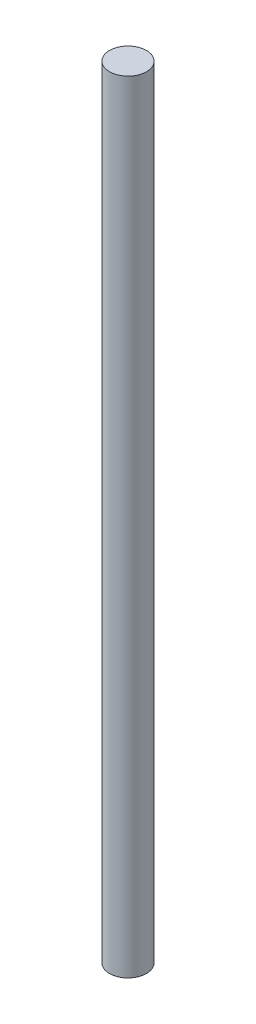
ISO-10303-21;
HEADER;
FILE_DESCRIPTION(('STEP AP214'),'2;1');
FILE_NAME('part.step','',(''),(''),'','','');
FILE_SCHEMA(('AUTOMOTIVE_DESIGN { 1 0 10303 214 1 1 1 1 }'));
ENDSEC;
DATA;
#1=APPLICATION_CONTEXT('core data for automotive mechanical design processes');
#2=APPLICATION_PROTOCOL_DEFINITION('international standard','automotive_design',2000,#1);
#3=PRODUCT_CONTEXT('',#1,'mechanical');
#4=PRODUCT('Part','Part','',(#3));
#5=PRODUCT_RELATED_PRODUCT_CATEGORY('part','',(#4));
#6=PRODUCT_DEFINITION_FORMATION('','',#4);
#7=PRODUCT_DEFINITION_CONTEXT('part definition',#1,'design');
#8=PRODUCT_DEFINITION('design','',#6,#7);
#9=PRODUCT_DEFINITION_SHAPE('','',#8);
#10=(LENGTH_UNIT() NAMED_UNIT(*) SI_UNIT(.MILLI.,.METRE.));
#11=(NAMED_UNIT(*) PLANE_ANGLE_UNIT() SI_UNIT($,.RADIAN.));
#12=(NAMED_UNIT(*) SI_UNIT($,.STERADIAN.) SOLID_ANGLE_UNIT());
#13=UNCERTAINTY_MEASURE_WITH_UNIT(LENGTH_MEASURE(1.E-05),#10,'distance_accuracy_value','');
#14=(GEOMETRIC_REPRESENTATION_CONTEXT(3) GLOBAL_UNCERTAINTY_ASSIGNED_CONTEXT((#13)) GLOBAL_UNIT_ASSIGNED_CONTEXT((#10,
#11,#12)) REPRESENTATION_CONTEXT('',''));
#15=CARTESIAN_POINT('',(0.,0.,0.));
#16=DIRECTION('',(0.,0.,1.));
#17=DIRECTION('',(1.,0.,0.));
#18=AXIS2_PLACEMENT_3D('',#15,#16,#17);
#19=CARTESIAN_POINT('',(0.,110.,0.));
#20=DIRECTION('',(0.,-1.,0.));
#21=DIRECTION('',(0.,0.,-1.));
#22=AXIS2_PLACEMENT_3D('',#19,#20,#21);
#23=CYLINDRICAL_SURFACE('',#22,2.6);
#24=CARTESIAN_POINT('',(0.,110.,0.));
#25=DIRECTION('',(0.,1.,0.));
#26=DIRECTION('',(0.,0.,1.));
#27=AXIS2_PLACEMENT_3D('',#24,#25,#26);
#28=CIRCLE('',#27,2.6);
#29=CARTESIAN_POINT('',(0.,110.,2.6));
#30=VERTEX_POINT('',#29);
#31=EDGE_CURVE('E10',#30,#30,#28,.T.);
#32=ORIENTED_EDGE('',*,*,#31,.F.);
#33=EDGE_LOOP('',(#32));
#34=FACE_BOUND('',#33,.T.);
#35=CARTESIAN_POINT('',(0.,0.,0.));
#36=DIRECTION('',(0.,1.,0.));
#37=DIRECTION('',(0.,0.,1.));
#38=AXIS2_PLACEMENT_3D('',#35,#36,#37);
#39=CIRCLE('',#38,2.6);
#40=CARTESIAN_POINT('',(0.,0.,2.6));
#41=VERTEX_POINT('',#40);
#42=EDGE_CURVE('E34',#41,#41,#39,.T.);
#43=ORIENTED_EDGE('',*,*,#42,.T.);
#44=EDGE_LOOP('',(#43));
#45=FACE_BOUND('',#44,.T.);
#46=ADVANCED_FACE('F31',(#34,#45),#23,.T.);
#47=CARTESIAN_POINT('',(0.,110.,0.));
#48=DIRECTION('',(0.,1.,0.));
#49=DIRECTION('',(0.,0.,1.));
#50=AXIS2_PLACEMENT_3D('',#47,#48,#49);
#51=PLANE('',#50);
#52=ORIENTED_EDGE('',*,*,#31,.T.);
#53=EDGE_LOOP('',(#52));
#54=FACE_BOUND('',#53,.T.);
#55=ADVANCED_FACE('F46',(#54),#51,.T.);
#56=CARTESIAN_POINT('',(0.,0.,0.));
#57=DIRECTION('',(0.,1.,0.));
#58=DIRECTION('',(0.,0.,1.));
#59=AXIS2_PLACEMENT_3D('',#56,#57,#58);
#60=PLANE('',#59);
#61=ORIENTED_EDGE('',*,*,#42,.F.);
#62=EDGE_LOOP('',(#61));
#63=FACE_BOUND('',#62,.T.);
#64=ADVANCED_FACE('F44',(#63),#60,.F.);
#65=CLOSED_SHELL('',(#46,#55,#64));
#66=MANIFOLD_SOLID_BREP('B2',#65);
#67=ADVANCED_BREP_SHAPE_REPRESENTATION('',(#18,#66),#14);
#68=SHAPE_DEFINITION_REPRESENTATION(#9,#67);
ENDSEC;
END-ISO-10303-21;
